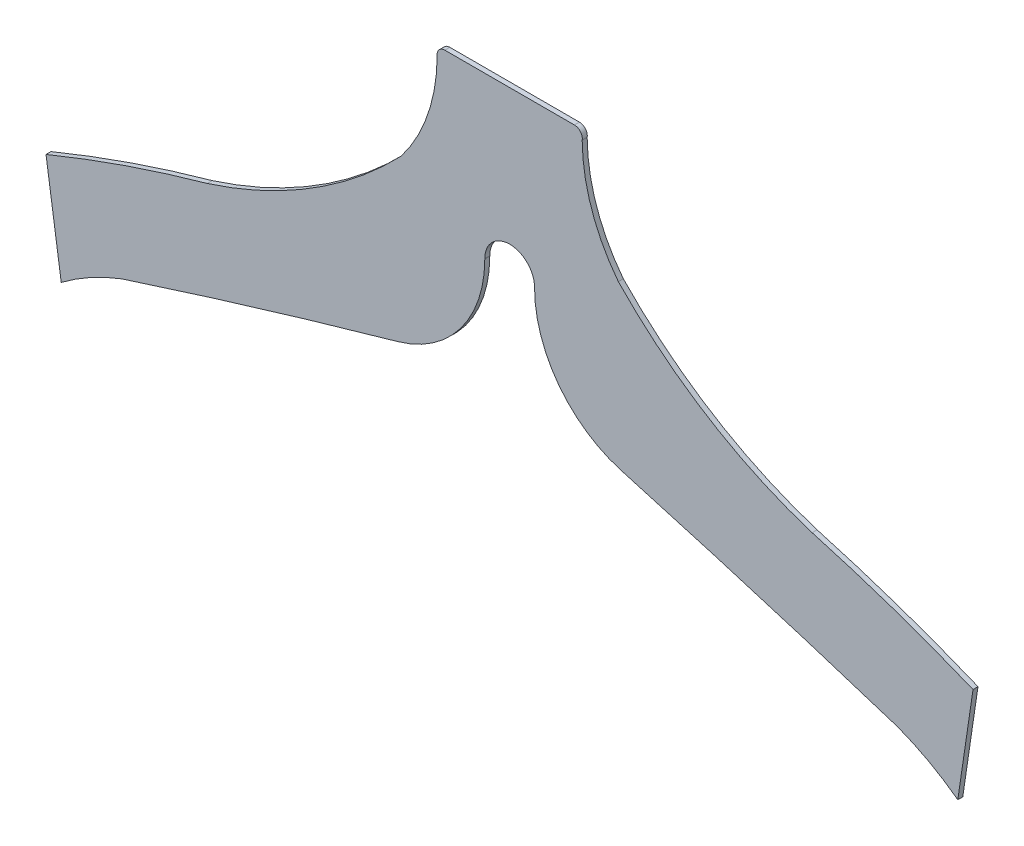
ISO-10303-21;
HEADER;
FILE_DESCRIPTION(('STEP AP214'),'2;1');
FILE_NAME('part.step','',(''),(''),'','','');
FILE_SCHEMA(('AUTOMOTIVE_DESIGN { 1 0 10303 214 1 1 1 1 }'));
ENDSEC;
DATA;
#1=APPLICATION_CONTEXT('core data for automotive mechanical design processes');
#2=APPLICATION_PROTOCOL_DEFINITION('international standard','automotive_design',2000,#1);
#3=PRODUCT_CONTEXT('',#1,'mechanical');
#4=PRODUCT('Part','Part','',(#3));
#5=PRODUCT_RELATED_PRODUCT_CATEGORY('part','',(#4));
#6=PRODUCT_DEFINITION_FORMATION('','',#4);
#7=PRODUCT_DEFINITION_CONTEXT('part definition',#1,'design');
#8=PRODUCT_DEFINITION('design','',#6,#7);
#9=PRODUCT_DEFINITION_SHAPE('','',#8);
#10=(LENGTH_UNIT() NAMED_UNIT(*) SI_UNIT(.MILLI.,.METRE.));
#11=(NAMED_UNIT(*) PLANE_ANGLE_UNIT() SI_UNIT($,.RADIAN.));
#12=(NAMED_UNIT(*) SI_UNIT($,.STERADIAN.) SOLID_ANGLE_UNIT());
#13=UNCERTAINTY_MEASURE_WITH_UNIT(LENGTH_MEASURE(1.E-05),#10,'distance_accuracy_value','');
#14=(GEOMETRIC_REPRESENTATION_CONTEXT(3) GLOBAL_UNCERTAINTY_ASSIGNED_CONTEXT((#13)) GLOBAL_UNIT_ASSIGNED_CONTEXT((#10,
#11,#12)) REPRESENTATION_CONTEXT('',''));
#15=CARTESIAN_POINT('',(0.,0.,0.));
#16=DIRECTION('',(0.,0.,1.));
#17=DIRECTION('',(1.,0.,0.));
#18=AXIS2_PLACEMENT_3D('',#15,#16,#17);
#19=CARTESIAN_POINT('',(-600.745447716728,679.701236138692,0.));
#20=DIRECTION('',(-0.989272155517059,-0.14608423021884,0.));
#21=DIRECTION('',(0.146084230218841,-0.989272155517059,0.));
#22=AXIS2_PLACEMENT_3D('',#19,#20,#21);
#23=PLANE('',#22);
#24=DIRECTION('',(0.146084230218841,-0.989272155517059,0.));
#25=VECTOR('',#24,1.);
#26=CARTESIAN_POINT('',(-231.23791311845,-1822.57785780754,6.35));
#27=LINE('',#26,#25);
#28=CARTESIAN_POINT('',(-591.383250780429,616.301095482348,6.35));
#29=VERTEX_POINT('',#28);
#30=CARTESIAN_POINT('',(-571.935506563414,484.602336398707,6.35));
#31=VERTEX_POINT('',#30);
#32=EDGE_CURVE('E324',#29,#31,#27,.T.);
#33=ORIENTED_EDGE('',*,*,#32,.F.);
#34=DIRECTION('',(0.,0.,-1.));
#35=VECTOR('',#34,1.);
#36=CARTESIAN_POINT('',(-591.383250780429,616.301095482348,6.35));
#37=LINE('',#36,#35);
#38=CARTESIAN_POINT('',(-591.383250780429,616.301095482348,0.));
#39=VERTEX_POINT('',#38);
#40=EDGE_CURVE('E40',#29,#39,#37,.T.);
#41=ORIENTED_EDGE('',*,*,#40,.T.);
#42=DIRECTION('',(0.146084230218841,-0.989272155517059,0.));
#43=VECTOR('',#42,1.);
#44=CARTESIAN_POINT('',(-231.23791311845,-1822.57785780754,0.));
#45=LINE('',#44,#43);
#46=CARTESIAN_POINT('',(-571.935506563414,484.602336398707,0.));
#47=VERTEX_POINT('',#46);
#48=EDGE_CURVE('E45',#39,#47,#45,.T.);
#49=ORIENTED_EDGE('',*,*,#48,.T.);
#50=DIRECTION('',(0.,0.,-1.));
#51=VECTOR('',#50,1.);
#52=CARTESIAN_POINT('',(-571.935506563414,484.602336398707,6.35));
#53=LINE('',#52,#51);
#54=EDGE_CURVE('E327',#31,#47,#53,.T.);
#55=ORIENTED_EDGE('',*,*,#54,.F.);
#56=EDGE_LOOP('',(#33,#41,#49,#55));
#57=FACE_BOUND('',#56,.T.);
#58=ADVANCED_FACE('F36',(#57),#23,.T.);
#59=CARTESIAN_POINT('',(600.745447716728,679.701236138692,0.));
#60=DIRECTION('',(0.989272155517059,-0.14608423021884,0.));
#61=DIRECTION('',(-0.146084230218841,-0.989272155517059,0.));
#62=AXIS2_PLACEMENT_3D('',#59,#60,#61);
#63=PLANE('',#62);
#64=DIRECTION('',(0.146084230218841,0.989272155517059,0.));
#65=VECTOR('',#64,1.);
#66=CARTESIAN_POINT('',(223.926911417989,-1872.08744827031,0.));
#67=LINE('',#66,#65);
#68=CARTESIAN_POINT('',(571.980617219463,484.90782259581,0.));
#69=VERTEX_POINT('',#68);
#70=CARTESIAN_POINT('',(591.409169958057,616.476618334353,0.));
#71=VERTEX_POINT('',#70);
#72=EDGE_CURVE('E11',#69,#71,#67,.T.);
#73=ORIENTED_EDGE('',*,*,#72,.T.);
#74=DIRECTION('',(0.,0.,-1.));
#75=VECTOR('',#74,1.);
#76=CARTESIAN_POINT('',(591.409169958056,616.476618334353,6.35));
#77=LINE('',#76,#75);
#78=CARTESIAN_POINT('',(591.409169958057,616.476618334353,6.35));
#79=VERTEX_POINT('',#78);
#80=EDGE_CURVE('E330',#71,#79,#77,.F.);
#81=ORIENTED_EDGE('',*,*,#80,.T.);
#82=DIRECTION('',(0.146084230218841,0.989272155517059,0.));
#83=VECTOR('',#82,1.);
#84=CARTESIAN_POINT('',(223.926911417989,-1872.08744827031,6.35));
#85=LINE('',#84,#83);
#86=CARTESIAN_POINT('',(571.980617219463,484.90782259581,6.35));
#87=VERTEX_POINT('',#86);
#88=EDGE_CURVE('E307',#87,#79,#85,.T.);
#89=ORIENTED_EDGE('',*,*,#88,.F.);
#90=DIRECTION('',(0.,0.,-1.));
#91=VECTOR('',#90,1.);
#92=CARTESIAN_POINT('',(571.980617219463,484.90782259581,6.35));
#93=LINE('',#92,#91);
#94=EDGE_CURVE('E328',#69,#87,#93,.F.);
#95=ORIENTED_EDGE('',*,*,#94,.F.);
#96=EDGE_LOOP('',(#73,#81,#89,#95));
#97=FACE_BOUND('',#96,.T.);
#98=ADVANCED_FACE('F38',(#97),#63,.T.);
#99=CARTESIAN_POINT('',(-383.332959387474,233.489196968218,6.35));
#100=DIRECTION('',(0.,0.,-1.));
#101=DIRECTION('',(-1.,0.,0.));
#102=AXIS2_PLACEMENT_3D('',#99,#100,#101);
#103=CYLINDRICAL_SURFACE('',#102,314.052112866462);
#104=CARTESIAN_POINT('',(-383.332959387474,233.489196968218,6.35));
#105=DIRECTION('',(0.,0.,1.));
#106=DIRECTION('',(1.,0.,0.));
#107=AXIS2_PLACEMENT_3D('',#104,#105,#106);
#108=CIRCLE('',#107,314.052112866462);
#109=CARTESIAN_POINT('',(-494.553522216318,527.187538808829,6.35));
#110=VERTEX_POINT('',#109);
#111=EDGE_CURVE('E214',#110,#31,#108,.T.);
#112=ORIENTED_EDGE('',*,*,#111,.T.);
#113=ORIENTED_EDGE('',*,*,#54,.T.);
#114=CARTESIAN_POINT('',(-383.332959387474,233.489196968218,0.));
#115=DIRECTION('',(0.,0.,1.));
#116=DIRECTION('',(1.,0.,0.));
#117=AXIS2_PLACEMENT_3D('',#114,#115,#116);
#118=CIRCLE('',#117,314.052112866462);
#119=CARTESIAN_POINT('',(-494.553522216318,527.187538808829,0.));
#120=VERTEX_POINT('',#119);
#121=EDGE_CURVE('E53',#120,#47,#118,.T.);
#122=ORIENTED_EDGE('',*,*,#121,.F.);
#123=DIRECTION('',(0.,0.,-1.));
#124=VECTOR('',#123,1.);
#125=CARTESIAN_POINT('',(-494.553522216318,527.187538808829,6.35));
#126=LINE('',#125,#124);
#127=EDGE_CURVE('E313',#110,#120,#126,.T.);
#128=ORIENTED_EDGE('',*,*,#127,.F.);
#129=EDGE_LOOP('',(#112,#113,#122,#128));
#130=FACE_BOUND('',#129,.T.);
#131=ADVANCED_FACE('F334',(#130),#103,.F.);
#132=CARTESIAN_POINT('',(2403.11800602695,-8397.29051944442,6.35));
#133=DIRECTION('',(0.,0.,-1.));
#134=DIRECTION('',(-1.,0.,0.));
#135=AXIS2_PLACEMENT_3D('',#132,#133,#134);
#136=CYLINDRICAL_SURFACE('',#135,9383.11296414123);
#137=CARTESIAN_POINT('',(2403.11800602695,-8397.29051944442,0.));
#138=DIRECTION('',(0.,0.,1.));
#139=DIRECTION('',(1.,0.,0.));
#140=AXIS2_PLACEMENT_3D('',#137,#138,#139);
#141=CIRCLE('',#140,9383.11296414123);
#142=CARTESIAN_POINT('',(-142.576700400888,633.89142753797,0.));
#143=VERTEX_POINT('',#142);
#144=EDGE_CURVE('E259',#143,#120,#141,.T.);
#145=ORIENTED_EDGE('',*,*,#144,.F.);
#146=DIRECTION('',(0.,0.,-1.));
#147=VECTOR('',#146,1.);
#148=CARTESIAN_POINT('',(-142.576700400888,633.89142753797,6.35));
#149=LINE('',#148,#147);
#150=CARTESIAN_POINT('',(-142.576700400888,633.89142753797,6.35));
#151=VERTEX_POINT('',#150);
#152=EDGE_CURVE('E311',#151,#143,#149,.T.);
#153=ORIENTED_EDGE('',*,*,#152,.F.);
#154=CARTESIAN_POINT('',(2403.11800602695,-8397.29051944442,6.35));
#155=DIRECTION('',(0.,0.,1.));
#156=DIRECTION('',(1.,0.,0.));
#157=AXIS2_PLACEMENT_3D('',#154,#155,#156);
#158=CIRCLE('',#157,9383.11296414123);
#159=EDGE_CURVE('E217',#151,#110,#158,.T.);
#160=ORIENTED_EDGE('',*,*,#159,.T.);
#161=ORIENTED_EDGE('',*,*,#127,.T.);
#162=EDGE_LOOP('',(#145,#153,#160,#161));
#163=FACE_BOUND('',#162,.T.);
#164=ADVANCED_FACE('F412',(#163),#136,.F.);
#165=CARTESIAN_POINT('',(-183.923732534228,780.575383489969,6.35));
#166=DIRECTION('',(0.,0.,-1.));
#167=DIRECTION('',(-1.,0.,0.));
#168=AXIS2_PLACEMENT_3D('',#165,#166,#167);
#169=CYLINDRICAL_SURFACE('',#168,152.399999999881);
#170=CARTESIAN_POINT('',(-183.923732534228,780.575383489969,0.));
#171=DIRECTION('',(0.,0.,1.));
#172=DIRECTION('',(1.,0.,0.));
#173=AXIS2_PLACEMENT_3D('',#170,#171,#172);
#174=CIRCLE('',#173,152.399999999881);
#175=CARTESIAN_POINT('',(-31.5237325343483,780.575383490106,0.));
#176=VERTEX_POINT('',#175);
#177=EDGE_CURVE('E261',#143,#176,#174,.T.);
#178=ORIENTED_EDGE('',*,*,#177,.T.);
#179=DIRECTION('',(0.,0.,-1.));
#180=VECTOR('',#179,1.);
#181=CARTESIAN_POINT('',(-31.5237325343483,780.575383490106,6.35));
#182=LINE('',#181,#180);
#183=CARTESIAN_POINT('',(-31.5237325343483,780.575383490106,6.35));
#184=VERTEX_POINT('',#183);
#185=EDGE_CURVE('E309',#184,#176,#182,.T.);
#186=ORIENTED_EDGE('',*,*,#185,.F.);
#187=CARTESIAN_POINT('',(-183.923732534228,780.575383489969,6.35));
#188=DIRECTION('',(0.,0.,1.));
#189=DIRECTION('',(1.,0.,0.));
#190=AXIS2_PLACEMENT_3D('',#187,#188,#189);
#191=CIRCLE('',#190,152.399999999881);
#192=EDGE_CURVE('E220',#151,#184,#191,.T.);
#193=ORIENTED_EDGE('',*,*,#192,.F.);
#194=ORIENTED_EDGE('',*,*,#152,.T.);
#195=EDGE_LOOP('',(#178,#186,#193,#194));
#196=FACE_BOUND('',#195,.T.);
#197=ADVANCED_FACE('F406',(#196),#169,.T.);
#198=CARTESIAN_POINT('',(-31.5237325383198,-1813.72592376637,6.35));
#199=DIRECTION('',(1.,-1.53087430841469E-12,0.));
#200=DIRECTION('',(1.53087430841469E-12,1.,0.));
#201=AXIS2_PLACEMENT_3D('',#198,#199,#200);
#202=PLANE('',#201);
#203=DIRECTION('',(-1.53087430841469E-12,-1.,0.));
#204=VECTOR('',#203,1.);
#205=CARTESIAN_POINT('',(-31.5237325383198,-1813.72592376637,0.));
#206=LINE('',#205,#204);
#207=CARTESIAN_POINT('',(-31.5237325343474,781.155560722697,0.));
#208=VERTEX_POINT('',#207);
#209=EDGE_CURVE('E264',#208,#176,#206,.T.);
#210=ORIENTED_EDGE('',*,*,#209,.F.);
#211=DIRECTION('',(0.,0.,-1.));
#212=VECTOR('',#211,1.);
#213=CARTESIAN_POINT('',(-31.5237325343474,781.155560722697,6.35));
#214=LINE('',#213,#212);
#215=CARTESIAN_POINT('',(-31.5237325343474,781.155560722697,6.35));
#216=VERTEX_POINT('',#215);
#217=EDGE_CURVE('E247',#216,#208,#214,.T.);
#218=ORIENTED_EDGE('',*,*,#217,.F.);
#219=DIRECTION('',(-1.53087430841469E-12,-1.,0.));
#220=VECTOR('',#219,1.);
#221=CARTESIAN_POINT('',(-31.5237325383198,-1813.72592376637,6.35));
#222=LINE('',#221,#220);
#223=EDGE_CURVE('E202',#216,#184,#222,.T.);
#224=ORIENTED_EDGE('',*,*,#223,.T.);
#225=ORIENTED_EDGE('',*,*,#185,.T.);
#226=EDGE_LOOP('',(#210,#218,#224,#225));
#227=FACE_BOUND('',#226,.T.);
#228=ADVANCED_FACE('F402',(#227),#202,.T.);
#229=CARTESIAN_POINT('',(0.226267465895713,781.155560722695,6.35));
#230=DIRECTION('',(0.,0.,-1.));
#231=DIRECTION('',(-1.,0.,0.));
#232=AXIS2_PLACEMENT_3D('',#229,#230,#231);
#233=CYLINDRICAL_SURFACE('',#232,31.7500000002426);
#234=CARTESIAN_POINT('',(0.226267465895713,781.155560722695,0.));
#235=DIRECTION('',(0.,0.,1.));
#236=DIRECTION('',(1.,0.,0.));
#237=AXIS2_PLACEMENT_3D('',#234,#235,#236);
#238=CIRCLE('',#237,31.7500000002426);
#239=CARTESIAN_POINT('',(31.9762674661388,781.155560722695,0.));
#240=VERTEX_POINT('',#239);
#241=EDGE_CURVE('E185',#240,#208,#238,.T.);
#242=ORIENTED_EDGE('',*,*,#241,.F.);
#243=DIRECTION('',(0.,0.,-1.));
#244=VECTOR('',#243,1.);
#245=CARTESIAN_POINT('',(31.9762674661388,781.155560722695,6.35));
#246=LINE('',#245,#244);
#247=CARTESIAN_POINT('',(31.9762674661388,781.155560722695,6.35));
#248=VERTEX_POINT('',#247);
#249=EDGE_CURVE('E178',#248,#240,#246,.T.);
#250=ORIENTED_EDGE('',*,*,#249,.F.);
#251=CARTESIAN_POINT('',(0.226267465895713,781.155560722695,6.35));
#252=DIRECTION('',(0.,0.,1.));
#253=DIRECTION('',(1.,0.,0.));
#254=AXIS2_PLACEMENT_3D('',#251,#252,#253);
#255=CIRCLE('',#254,31.7500000002426);
#256=EDGE_CURVE('E182',#248,#216,#255,.T.);
#257=ORIENTED_EDGE('',*,*,#256,.T.);
#258=ORIENTED_EDGE('',*,*,#217,.T.);
#259=EDGE_LOOP('',(#242,#250,#257,#258));
#260=FACE_BOUND('',#259,.T.);
#261=ADVANCED_FACE('F180',(#260),#233,.F.);
#262=CARTESIAN_POINT('',(31.9762674641526,-1813.72592376631,6.35));
#263=DIRECTION('',(1.,-7.65437154209687E-13,0.));
#264=DIRECTION('',(7.65437154209687E-13,1.,0.));
#265=AXIS2_PLACEMENT_3D('',#262,#263,#264);
#266=PLANE('',#265);
#267=DIRECTION('',(-7.65437154209687E-13,-1.,0.));
#268=VECTOR('',#267,1.);
#269=CARTESIAN_POINT('',(31.9762674641526,-1813.72592376631,0.));
#270=LINE('',#269,#268);
#271=CARTESIAN_POINT('',(31.9762674661384,780.575383490106,0.));
#272=VERTEX_POINT('',#271);
#273=EDGE_CURVE('E249',#240,#272,#270,.T.);
#274=ORIENTED_EDGE('',*,*,#273,.T.);
#275=DIRECTION('',(0.,0.,-1.));
#276=VECTOR('',#275,1.);
#277=CARTESIAN_POINT('',(31.9762674661384,780.575383490106,6.35));
#278=LINE('',#277,#276);
#279=CARTESIAN_POINT('',(31.9762674661384,780.575383490106,6.35));
#280=VERTEX_POINT('',#279);
#281=EDGE_CURVE('E189',#280,#272,#278,.T.);
#282=ORIENTED_EDGE('',*,*,#281,.F.);
#283=DIRECTION('',(-7.65437154209687E-13,-1.,0.));
#284=VECTOR('',#283,1.);
#285=CARTESIAN_POINT('',(31.9762674641526,-1813.72592376631,6.35));
#286=LINE('',#285,#284);
#287=EDGE_CURVE('E192',#248,#280,#286,.T.);
#288=ORIENTED_EDGE('',*,*,#287,.F.);
#289=ORIENTED_EDGE('',*,*,#249,.T.);
#290=EDGE_LOOP('',(#274,#282,#288,#289));
#291=FACE_BOUND('',#290,.T.);
#292=ADVANCED_FACE('F193',(#291),#266,.F.);
#293=CARTESIAN_POINT('',(184.376267466019,780.575383489968,6.35));
#294=DIRECTION('',(0.,0.,-1.));
#295=DIRECTION('',(-1.,0.,0.));
#296=AXIS2_PLACEMENT_3D('',#293,#294,#295);
#297=CYLINDRICAL_SURFACE('',#296,152.39999999988);
#298=CARTESIAN_POINT('',(184.376267466019,780.575383489968,0.));
#299=DIRECTION('',(0.,0.,1.));
#300=DIRECTION('',(1.,0.,0.));
#301=AXIS2_PLACEMENT_3D('',#298,#299,#300);
#302=CIRCLE('',#301,152.39999999988);
#303=CARTESIAN_POINT('',(143.02923533268,633.89142753797,0.));
#304=VERTEX_POINT('',#303);
#305=EDGE_CURVE('E251',#272,#304,#302,.T.);
#306=ORIENTED_EDGE('',*,*,#305,.T.);
#307=DIRECTION('',(0.,0.,-1.));
#308=VECTOR('',#307,1.);
#309=CARTESIAN_POINT('',(143.02923533268,633.89142753797,6.35));
#310=LINE('',#309,#308);
#311=CARTESIAN_POINT('',(143.02923533268,633.89142753797,6.35));
#312=VERTEX_POINT('',#311);
#313=EDGE_CURVE('E317',#312,#304,#310,.T.);
#314=ORIENTED_EDGE('',*,*,#313,.F.);
#315=CARTESIAN_POINT('',(184.376267466019,780.575383489968,6.35));
#316=DIRECTION('',(0.,0.,1.));
#317=DIRECTION('',(1.,0.,0.));
#318=AXIS2_PLACEMENT_3D('',#315,#316,#317);
#319=CIRCLE('',#318,152.39999999988);
#320=EDGE_CURVE('E197',#280,#312,#319,.T.);
#321=ORIENTED_EDGE('',*,*,#320,.F.);
#322=ORIENTED_EDGE('',*,*,#281,.T.);
#323=EDGE_LOOP('',(#306,#314,#321,#322));
#324=FACE_BOUND('',#323,.T.);
#325=ADVANCED_FACE('F387',(#324),#297,.T.);
#326=CARTESIAN_POINT('',(-2402.66547109516,-8397.29051944442,6.35));
#327=DIRECTION('',(0.,0.,-1.));
#328=DIRECTION('',(-1.,0.,0.));
#329=AXIS2_PLACEMENT_3D('',#326,#327,#328);
#330=CYLINDRICAL_SURFACE('',#329,9383.11296414123);
#331=CARTESIAN_POINT('',(-2402.66547109516,-8397.29051944442,0.));
#332=DIRECTION('',(0.,0.,1.));
#333=DIRECTION('',(1.,0.,0.));
#334=AXIS2_PLACEMENT_3D('',#331,#332,#333);
#335=CIRCLE('',#334,9383.11296414123);
#336=CARTESIAN_POINT('',(495.006057148107,527.187538808828,0.));
#337=VERTEX_POINT('',#336);
#338=EDGE_CURVE('E254',#337,#304,#335,.T.);
#339=ORIENTED_EDGE('',*,*,#338,.F.);
#340=DIRECTION('',(0.,0.,-1.));
#341=VECTOR('',#340,1.);
#342=CARTESIAN_POINT('',(495.006057148107,527.187538808828,6.35));
#343=LINE('',#342,#341);
#344=CARTESIAN_POINT('',(495.006057148107,527.187538808828,6.35));
#345=VERTEX_POINT('',#344);
#346=EDGE_CURVE('E315',#345,#337,#343,.T.);
#347=ORIENTED_EDGE('',*,*,#346,.F.);
#348=CARTESIAN_POINT('',(-2402.66547109516,-8397.29051944442,6.35));
#349=DIRECTION('',(0.,0.,1.));
#350=DIRECTION('',(1.,0.,0.));
#351=AXIS2_PLACEMENT_3D('',#348,#349,#350);
#352=CIRCLE('',#351,9383.11296414123);
#353=EDGE_CURVE('E209',#345,#312,#352,.T.);
#354=ORIENTED_EDGE('',*,*,#353,.T.);
#355=ORIENTED_EDGE('',*,*,#313,.T.);
#356=EDGE_LOOP('',(#339,#347,#354,#355));
#357=FACE_BOUND('',#356,.T.);
#358=ADVANCED_FACE('F384',(#357),#330,.F.);
#359=CARTESIAN_POINT('',(383.785494319262,233.489196968216,6.35));
#360=DIRECTION('',(0.,0.,-1.));
#361=DIRECTION('',(-1.,0.,0.));
#362=AXIS2_PLACEMENT_3D('',#359,#360,#361);
#363=CYLINDRICAL_SURFACE('',#362,314.052112866464);
#364=CARTESIAN_POINT('',(383.785494319262,233.489196968216,0.));
#365=DIRECTION('',(0.,0.,1.));
#366=DIRECTION('',(1.,0.,0.));
#367=AXIS2_PLACEMENT_3D('',#364,#365,#366);
#368=CIRCLE('',#367,314.052112866464);
#369=EDGE_CURVE('E61',#69,#337,#368,.T.);
#370=ORIENTED_EDGE('',*,*,#369,.F.);
#371=ORIENTED_EDGE('',*,*,#94,.T.);
#372=CARTESIAN_POINT('',(383.785494319262,233.489196968216,6.35));
#373=DIRECTION('',(0.,0.,1.));
#374=DIRECTION('',(1.,0.,0.));
#375=AXIS2_PLACEMENT_3D('',#372,#373,#374);
#376=CIRCLE('',#375,314.052112866464);
#377=EDGE_CURVE('E212',#87,#345,#376,.T.);
#378=ORIENTED_EDGE('',*,*,#377,.T.);
#379=ORIENTED_EDGE('',*,*,#346,.T.);
#380=EDGE_LOOP('',(#370,#371,#378,#379));
#381=FACE_BOUND('',#380,.T.);
#382=ADVANCED_FACE('F378',(#381),#363,.F.);
#383=CARTESIAN_POINT('',(-109.612360303509,-1087.9923765883,6.35));
#384=DIRECTION('',(0.,0.,-1.));
#385=DIRECTION('',(-1.,0.,0.));
#386=AXIS2_PLACEMENT_3D('',#383,#384,#385);
#387=CYLINDRICAL_SURFACE('',#386,1842.99911571951);
#388=ORIENTED_EDGE('',*,*,#80,.F.);
#389=CARTESIAN_POINT('',(-109.612360303509,-1087.9923765883,0.));
#390=DIRECTION('',(0.,0.,1.));
#391=DIRECTION('',(1.,0.,0.));
#392=AXIS2_PLACEMENT_3D('',#389,#390,#391);
#393=CIRCLE('',#392,1842.99911571951);
#394=CARTESIAN_POINT('',(386.141526030537,687.077713500426,0.));
#395=VERTEX_POINT('',#394);
#396=EDGE_CURVE('E267',#71,#395,#393,.T.);
#397=ORIENTED_EDGE('',*,*,#396,.T.);
#398=DIRECTION('',(0.,0.,-1.));
#399=VECTOR('',#398,1.);
#400=CARTESIAN_POINT('',(386.141526030537,687.077713500426,6.35));
#401=LINE('',#400,#399);
#402=CARTESIAN_POINT('',(386.141526030537,687.077713500426,6.35));
#403=VERTEX_POINT('',#402);
#404=EDGE_CURVE('E304',#403,#395,#401,.T.);
#405=ORIENTED_EDGE('',*,*,#404,.F.);
#406=CARTESIAN_POINT('',(-109.612360303509,-1087.9923765883,6.35));
#407=DIRECTION('',(0.,0.,1.));
#408=DIRECTION('',(1.,0.,0.));
#409=AXIS2_PLACEMENT_3D('',#406,#407,#408);
#410=CIRCLE('',#409,1842.99911571951);
#411=EDGE_CURVE('E223',#79,#403,#410,.T.);
#412=ORIENTED_EDGE('',*,*,#411,.F.);
#413=EDGE_LOOP('',(#388,#397,#405,#412));
#414=FACE_BOUND('',#413,.T.);
#415=ADVANCED_FACE('F375',(#414),#387,.T.);
#416=CARTESIAN_POINT('',(564.575105895512,1249.76061826541,6.35));
#417=DIRECTION('',(0.,0.,-1.));
#418=DIRECTION('',(-1.,0.,0.));
#419=AXIS2_PLACEMENT_3D('',#416,#417,#418);
#420=CYLINDRICAL_SURFACE('',#419,590.297038564647);
#421=CARTESIAN_POINT('',(564.575105895512,1249.76061826541,0.));
#422=DIRECTION('',(0.,0.,1.));
#423=DIRECTION('',(1.,0.,0.));
#424=AXIS2_PLACEMENT_3D('',#421,#422,#423);
#425=CIRCLE('',#424,590.297038564647);
#426=CARTESIAN_POINT('',(138.868045521316,840.830193271435,0.));
#427=VERTEX_POINT('',#426);
#428=EDGE_CURVE('E269',#427,#395,#425,.T.);
#429=ORIENTED_EDGE('',*,*,#428,.F.);
#430=DIRECTION('',(0.,0.,-1.));
#431=VECTOR('',#430,1.);
#432=CARTESIAN_POINT('',(138.868045521316,840.830193271435,6.35));
#433=LINE('',#432,#431);
#434=CARTESIAN_POINT('',(138.868045521316,840.830193271435,6.35));
#435=VERTEX_POINT('',#434);
#436=EDGE_CURVE('E302',#435,#427,#433,.T.);
#437=ORIENTED_EDGE('',*,*,#436,.F.);
#438=CARTESIAN_POINT('',(564.575105895512,1249.76061826541,6.35));
#439=DIRECTION('',(0.,0.,1.));
#440=DIRECTION('',(1.,0.,0.));
#441=AXIS2_PLACEMENT_3D('',#438,#439,#440);
#442=CIRCLE('',#441,590.297038564647);
#443=EDGE_CURVE('E225',#435,#403,#442,.T.);
#444=ORIENTED_EDGE('',*,*,#443,.T.);
#445=ORIENTED_EDGE('',*,*,#404,.T.);
#446=EDGE_LOOP('',(#429,#437,#444,#445));
#447=FACE_BOUND('',#446,.T.);
#448=ADVANCED_FACE('F369',(#447),#420,.F.);
#449=CARTESIAN_POINT('',(312.594828939126,975.613511415756,6.35));
#450=DIRECTION('',(0.,0.,-1.));
#451=DIRECTION('',(-1.,0.,0.));
#452=AXIS2_PLACEMENT_3D('',#449,#450,#451);
#453=CYLINDRICAL_SURFACE('',#452,219.880736142782);
#454=CARTESIAN_POINT('',(312.594828939126,975.613511415756,0.));
#455=DIRECTION('',(0.,0.,1.));
#456=DIRECTION('',(1.,0.,0.));
#457=AXIS2_PLACEMENT_3D('',#454,#455,#456);
#458=CIRCLE('',#457,219.880736142782);
#459=CARTESIAN_POINT('',(92.7193109899475,974.098673711054,0.));
#460=VERTEX_POINT('',#459);
#461=EDGE_CURVE('E272',#460,#427,#458,.T.);
#462=ORIENTED_EDGE('',*,*,#461,.F.);
#463=DIRECTION('',(0.,0.,-1.));
#464=VECTOR('',#463,1.);
#465=CARTESIAN_POINT('',(92.7193109899475,974.098673711054,6.35));
#466=LINE('',#465,#464);
#467=CARTESIAN_POINT('',(92.7193109899475,974.098673711054,6.35));
#468=VERTEX_POINT('',#467);
#469=EDGE_CURVE('E300',#468,#460,#466,.T.);
#470=ORIENTED_EDGE('',*,*,#469,.F.);
#471=CARTESIAN_POINT('',(312.594828939126,975.613511415756,6.35));
#472=DIRECTION('',(0.,0.,1.));
#473=DIRECTION('',(1.,0.,0.));
#474=AXIS2_PLACEMENT_3D('',#471,#472,#473);
#475=CIRCLE('',#474,219.880736142782);
#476=EDGE_CURVE('E228',#468,#435,#475,.T.);
#477=ORIENTED_EDGE('',*,*,#476,.T.);
#478=ORIENTED_EDGE('',*,*,#436,.T.);
#479=EDGE_LOOP('',(#462,#470,#477,#478));
#480=FACE_BOUND('',#479,.T.);
#481=ADVANCED_FACE('F364',(#480),#453,.F.);
#482=CARTESIAN_POINT('',(82.8774000189125,975.946165185431,6.35));
#483=DIRECTION('',(0.,0.,-1.));
#484=DIRECTION('',(-1.,0.,0.));
#485=AXIS2_PLACEMENT_3D('',#482,#483,#484);
#486=CYLINDRICAL_SURFACE('',#485,10.0138122765345);
#487=CARTESIAN_POINT('',(82.8774000189125,975.946165185431,0.));
#488=DIRECTION('',(0.,0.,1.));
#489=DIRECTION('',(1.,0.,0.));
#490=AXIS2_PLACEMENT_3D('',#487,#488,#489);
#491=CIRCLE('',#490,10.0138122765345);
#492=CARTESIAN_POINT('',(82.8774000189117,985.959977461967,0.));
#493=VERTEX_POINT('',#492);
#494=EDGE_CURVE('E275',#460,#493,#491,.T.);
#495=ORIENTED_EDGE('',*,*,#494,.T.);
#496=DIRECTION('',(0.,0.,-1.));
#497=VECTOR('',#496,1.);
#498=CARTESIAN_POINT('',(82.8774000189117,985.959977461967,6.35));
#499=LINE('',#498,#497);
#500=CARTESIAN_POINT('',(82.8774000189117,985.959977461967,6.35));
#501=VERTEX_POINT('',#500);
#502=EDGE_CURVE('E297',#501,#493,#499,.T.);
#503=ORIENTED_EDGE('',*,*,#502,.F.);
#504=CARTESIAN_POINT('',(82.8774000189125,975.946165185431,6.35));
#505=DIRECTION('',(0.,0.,1.));
#506=DIRECTION('',(1.,0.,0.));
#507=AXIS2_PLACEMENT_3D('',#504,#505,#506);
#508=CIRCLE('',#507,10.0138122765345);
#509=EDGE_CURVE('E231',#468,#501,#508,.T.);
#510=ORIENTED_EDGE('',*,*,#509,.F.);
#511=ORIENTED_EDGE('',*,*,#469,.T.);
#512=EDGE_LOOP('',(#495,#503,#510,#511));
#513=FACE_BOUND('',#512,.T.);
#514=ADVANCED_FACE('F361',(#513),#486,.T.);
#515=CARTESIAN_POINT('',(-171.293236978546,985.959977461967,6.35));
#516=DIRECTION('',(0.,-1.,0.));
#517=DIRECTION('',(0.,0.,-1.));
#518=AXIS2_PLACEMENT_3D('',#515,#516,#517);
#519=PLANE('',#518);
#520=DIRECTION('',(-1.,0.,0.));
#521=VECTOR('',#520,1.);
#522=CARTESIAN_POINT('',(-171.293236978546,985.959977461967,0.));
#523=LINE('',#522,#521);
#524=CARTESIAN_POINT('',(-82.4248650505361,985.959977461966,0.));
#525=VERTEX_POINT('',#524);
#526=EDGE_CURVE('E278',#493,#525,#523,.T.);
#527=ORIENTED_EDGE('',*,*,#526,.T.);
#528=DIRECTION('',(0.,0.,-1.));
#529=VECTOR('',#528,1.);
#530=CARTESIAN_POINT('',(-82.4248650505361,985.959977461966,6.35));
#531=LINE('',#530,#529);
#532=CARTESIAN_POINT('',(-82.4248650505361,985.959977461966,6.35));
#533=VERTEX_POINT('',#532);
#534=EDGE_CURVE('E294',#533,#525,#531,.T.);
#535=ORIENTED_EDGE('',*,*,#534,.F.);
#536=DIRECTION('',(-1.,0.,0.));
#537=VECTOR('',#536,1.);
#538=CARTESIAN_POINT('',(-171.293236978546,985.959977461967,6.35));
#539=LINE('',#538,#537);
#540=EDGE_CURVE('E234',#501,#533,#539,.T.);
#541=ORIENTED_EDGE('',*,*,#540,.F.);
#542=ORIENTED_EDGE('',*,*,#502,.T.);
#543=EDGE_LOOP('',(#527,#535,#541,#542));
#544=FACE_BOUND('',#543,.T.);
#545=ADVANCED_FACE('F357',(#544),#519,.F.);
#546=CARTESIAN_POINT('',(-82.4248650505366,975.946165185432,6.35));
#547=DIRECTION('',(0.,0.,-1.));
#548=DIRECTION('',(-1.,0.,0.));
#549=AXIS2_PLACEMENT_3D('',#546,#547,#548);
#550=CYLINDRICAL_SURFACE('',#549,10.0138122765346);
#551=CARTESIAN_POINT('',(-82.4248650505366,975.946165185432,0.));
#552=DIRECTION('',(0.,0.,1.));
#553=DIRECTION('',(1.,0.,0.));
#554=AXIS2_PLACEMENT_3D('',#551,#552,#553);
#555=CIRCLE('',#554,10.0138122765346);
#556=CARTESIAN_POINT('',(-92.2667760215716,974.098673711055,0.));
#557=VERTEX_POINT('',#556);
#558=EDGE_CURVE('E281',#525,#557,#555,.T.);
#559=ORIENTED_EDGE('',*,*,#558,.T.);
#560=DIRECTION('',(0.,0.,-1.));
#561=VECTOR('',#560,1.);
#562=CARTESIAN_POINT('',(-92.2667760215716,974.098673711055,6.35));
#563=LINE('',#562,#561);
#564=CARTESIAN_POINT('',(-92.2667760215716,974.098673711055,6.35));
#565=VERTEX_POINT('',#564);
#566=EDGE_CURVE('E292',#565,#557,#563,.T.);
#567=ORIENTED_EDGE('',*,*,#566,.F.);
#568=CARTESIAN_POINT('',(-82.4248650505366,975.946165185432,6.35));
#569=DIRECTION('',(0.,0.,1.));
#570=DIRECTION('',(1.,0.,0.));
#571=AXIS2_PLACEMENT_3D('',#568,#569,#570);
#572=CIRCLE('',#571,10.0138122765346);
#573=EDGE_CURVE('E237',#533,#565,#572,.T.);
#574=ORIENTED_EDGE('',*,*,#573,.F.);
#575=ORIENTED_EDGE('',*,*,#534,.T.);
#576=EDGE_LOOP('',(#559,#567,#574,#575));
#577=FACE_BOUND('',#576,.T.);
#578=ADVANCED_FACE('F355',(#577),#550,.T.);
#579=CARTESIAN_POINT('',(-312.142293970751,975.613511415755,6.35));
#580=DIRECTION('',(0.,0.,-1.));
#581=DIRECTION('',(-1.,0.,0.));
#582=AXIS2_PLACEMENT_3D('',#579,#580,#581);
#583=CYLINDRICAL_SURFACE('',#582,219.880736142781);
#584=CARTESIAN_POINT('',(-312.142293970751,975.613511415755,0.));
#585=DIRECTION('',(0.,0.,1.));
#586=DIRECTION('',(1.,0.,0.));
#587=AXIS2_PLACEMENT_3D('',#584,#585,#586);
#588=CIRCLE('',#587,219.880736142781);
#589=CARTESIAN_POINT('',(-138.415510553038,840.830193271311,0.));
#590=VERTEX_POINT('',#589);
#591=EDGE_CURVE('E284',#590,#557,#588,.T.);
#592=ORIENTED_EDGE('',*,*,#591,.F.);
#593=DIRECTION('',(0.,0.,-1.));
#594=VECTOR('',#593,1.);
#595=CARTESIAN_POINT('',(-138.415510553038,840.830193271311,6.35));
#596=LINE('',#595,#594);
#597=CARTESIAN_POINT('',(-138.415510553038,840.830193271311,6.35));
#598=VERTEX_POINT('',#597);
#599=EDGE_CURVE('E290',#598,#590,#596,.T.);
#600=ORIENTED_EDGE('',*,*,#599,.F.);
#601=CARTESIAN_POINT('',(-312.142293970751,975.613511415755,6.35));
#602=DIRECTION('',(0.,0.,1.));
#603=DIRECTION('',(1.,0.,0.));
#604=AXIS2_PLACEMENT_3D('',#601,#602,#603);
#605=CIRCLE('',#604,219.880736142781);
#606=EDGE_CURVE('E239',#598,#565,#605,.T.);
#607=ORIENTED_EDGE('',*,*,#606,.T.);
#608=ORIENTED_EDGE('',*,*,#566,.T.);
#609=EDGE_LOOP('',(#592,#600,#607,#608));
#610=FACE_BOUND('',#609,.T.);
#611=ADVANCED_FACE('F350',(#610),#583,.F.);
#612=CARTESIAN_POINT('',(-564.122570927124,1249.7606182654,6.35));
#613=DIRECTION('',(0.,0.,-1.));
#614=DIRECTION('',(-1.,0.,0.));
#615=AXIS2_PLACEMENT_3D('',#612,#613,#614);
#616=CYLINDRICAL_SURFACE('',#615,590.297038564644);
#617=CARTESIAN_POINT('',(-564.122570927124,1249.7606182654,0.));
#618=DIRECTION('',(0.,0.,1.));
#619=DIRECTION('',(1.,0.,0.));
#620=AXIS2_PLACEMENT_3D('',#617,#618,#619);
#621=CIRCLE('',#620,590.297038564644);
#622=CARTESIAN_POINT('',(-385.688991062142,687.077713500417,0.));
#623=VERTEX_POINT('',#622);
#624=EDGE_CURVE('E205',#623,#590,#621,.T.);
#625=ORIENTED_EDGE('',*,*,#624,.F.);
#626=DIRECTION('',(0.,0.,-1.));
#627=VECTOR('',#626,1.);
#628=CARTESIAN_POINT('',(-385.688991062142,687.077713500417,6.35));
#629=LINE('',#628,#627);
#630=CARTESIAN_POINT('',(-385.688991062142,687.077713500417,6.35));
#631=VERTEX_POINT('',#630);
#632=EDGE_CURVE('E188',#631,#623,#629,.T.);
#633=ORIENTED_EDGE('',*,*,#632,.F.);
#634=CARTESIAN_POINT('',(-564.122570927124,1249.7606182654,6.35));
#635=DIRECTION('',(0.,0.,1.));
#636=DIRECTION('',(1.,0.,0.));
#637=AXIS2_PLACEMENT_3D('',#634,#635,#636);
#638=CIRCLE('',#637,590.297038564644);
#639=EDGE_CURVE('E242',#631,#598,#638,.T.);
#640=ORIENTED_EDGE('',*,*,#639,.T.);
#641=ORIENTED_EDGE('',*,*,#599,.T.);
#642=EDGE_LOOP('',(#625,#633,#640,#641));
#643=FACE_BOUND('',#642,.T.);
#644=ADVANCED_FACE('F344',(#643),#616,.F.);
#645=CARTESIAN_POINT('',(110.064895271897,-1087.99237658831,6.35));
#646=DIRECTION('',(0.,0.,-1.));
#647=DIRECTION('',(-1.,0.,0.));
#648=AXIS2_PLACEMENT_3D('',#645,#646,#647);
#649=CYLINDRICAL_SURFACE('',#648,1842.99911571951);
#650=ORIENTED_EDGE('',*,*,#40,.F.);
#651=CARTESIAN_POINT('',(110.064895271897,-1087.99237658831,6.35));
#652=DIRECTION('',(0.,0.,1.));
#653=DIRECTION('',(1.,0.,0.));
#654=AXIS2_PLACEMENT_3D('',#651,#652,#653);
#655=CIRCLE('',#654,1842.99911571951);
#656=EDGE_CURVE('E245',#631,#29,#655,.T.);
#657=ORIENTED_EDGE('',*,*,#656,.F.);
#658=ORIENTED_EDGE('',*,*,#632,.T.);
#659=CARTESIAN_POINT('',(110.064895271897,-1087.99237658831,0.));
#660=DIRECTION('',(0.,0.,1.));
#661=DIRECTION('',(1.,0.,0.));
#662=AXIS2_PLACEMENT_3D('',#659,#660,#661);
#663=CIRCLE('',#662,1842.99911571951);
#664=EDGE_CURVE('E203',#623,#39,#663,.T.);
#665=ORIENTED_EDGE('',*,*,#664,.T.);
#666=EDGE_LOOP('',(#650,#657,#658,#665));
#667=FACE_BOUND('',#666,.T.);
#668=ADVANCED_FACE('F446',(#667),#649,.T.);
#669=CARTESIAN_POINT('',(-171.293236978546,-1813.72592376616,0.));
#670=DIRECTION('',(0.,0.,1.));
#671=DIRECTION('',(1.,0.,0.));
#672=AXIS2_PLACEMENT_3D('',#669,#670,#671);
#673=PLANE('',#672);
#674=ORIENTED_EDGE('',*,*,#48,.F.);
#675=ORIENTED_EDGE('',*,*,#664,.F.);
#676=ORIENTED_EDGE('',*,*,#624,.T.);
#677=ORIENTED_EDGE('',*,*,#591,.T.);
#678=ORIENTED_EDGE('',*,*,#558,.F.);
#679=ORIENTED_EDGE('',*,*,#526,.F.);
#680=ORIENTED_EDGE('',*,*,#494,.F.);
#681=ORIENTED_EDGE('',*,*,#461,.T.);
#682=ORIENTED_EDGE('',*,*,#428,.T.);
#683=ORIENTED_EDGE('',*,*,#396,.F.);
#684=ORIENTED_EDGE('',*,*,#72,.F.);
#685=ORIENTED_EDGE('',*,*,#369,.T.);
#686=ORIENTED_EDGE('',*,*,#338,.T.);
#687=ORIENTED_EDGE('',*,*,#305,.F.);
#688=ORIENTED_EDGE('',*,*,#273,.F.);
#689=ORIENTED_EDGE('',*,*,#241,.T.);
#690=ORIENTED_EDGE('',*,*,#209,.T.);
#691=ORIENTED_EDGE('',*,*,#177,.F.);
#692=ORIENTED_EDGE('',*,*,#144,.T.);
#693=ORIENTED_EDGE('',*,*,#121,.T.);
#694=EDGE_LOOP('',(#674,#675,#676,#677,#678,#679,#680,#681,#682,#683,#684,#685,#686,#687,#688,
#689,#690,#691,#692,#693));
#695=FACE_BOUND('',#694,.T.);
#696=ADVANCED_FACE('F340',(#695),#673,.F.);
#697=CARTESIAN_POINT('',(-171.293236978546,-1813.72592376616,6.35));
#698=DIRECTION('',(0.,0.,1.));
#699=DIRECTION('',(1.,0.,0.));
#700=AXIS2_PLACEMENT_3D('',#697,#698,#699);
#701=PLANE('',#700);
#702=ORIENTED_EDGE('',*,*,#656,.T.);
#703=ORIENTED_EDGE('',*,*,#32,.T.);
#704=ORIENTED_EDGE('',*,*,#111,.F.);
#705=ORIENTED_EDGE('',*,*,#159,.F.);
#706=ORIENTED_EDGE('',*,*,#192,.T.);
#707=ORIENTED_EDGE('',*,*,#223,.F.);
#708=ORIENTED_EDGE('',*,*,#256,.F.);
#709=ORIENTED_EDGE('',*,*,#287,.T.);
#710=ORIENTED_EDGE('',*,*,#320,.T.);
#711=ORIENTED_EDGE('',*,*,#353,.F.);
#712=ORIENTED_EDGE('',*,*,#377,.F.);
#713=ORIENTED_EDGE('',*,*,#88,.T.);
#714=ORIENTED_EDGE('',*,*,#411,.T.);
#715=ORIENTED_EDGE('',*,*,#443,.F.);
#716=ORIENTED_EDGE('',*,*,#476,.F.);
#717=ORIENTED_EDGE('',*,*,#509,.T.);
#718=ORIENTED_EDGE('',*,*,#540,.T.);
#719=ORIENTED_EDGE('',*,*,#573,.T.);
#720=ORIENTED_EDGE('',*,*,#606,.F.);
#721=ORIENTED_EDGE('',*,*,#639,.F.);
#722=EDGE_LOOP('',(#702,#703,#704,#705,#706,#707,#708,#709,#710,#711,#712,#713,#714,#715,#716,
#717,#718,#719,#720,#721));
#723=FACE_BOUND('',#722,.T.);
#724=ADVANCED_FACE('F200',(#723),#701,.T.);
#725=CLOSED_SHELL('',(#58,#98,#131,#164,#197,#228,#261,#292,#325,#358,#382,#415,#448,#481,#514,
#545,#578,#611,#644,#668,#696,#724));
#726=MANIFOLD_SOLID_BREP('B2',#725);
#727=ADVANCED_BREP_SHAPE_REPRESENTATION('',(#18,#726),#14);
#728=SHAPE_DEFINITION_REPRESENTATION(#9,#727);
ENDSEC;
END-ISO-10303-21;
